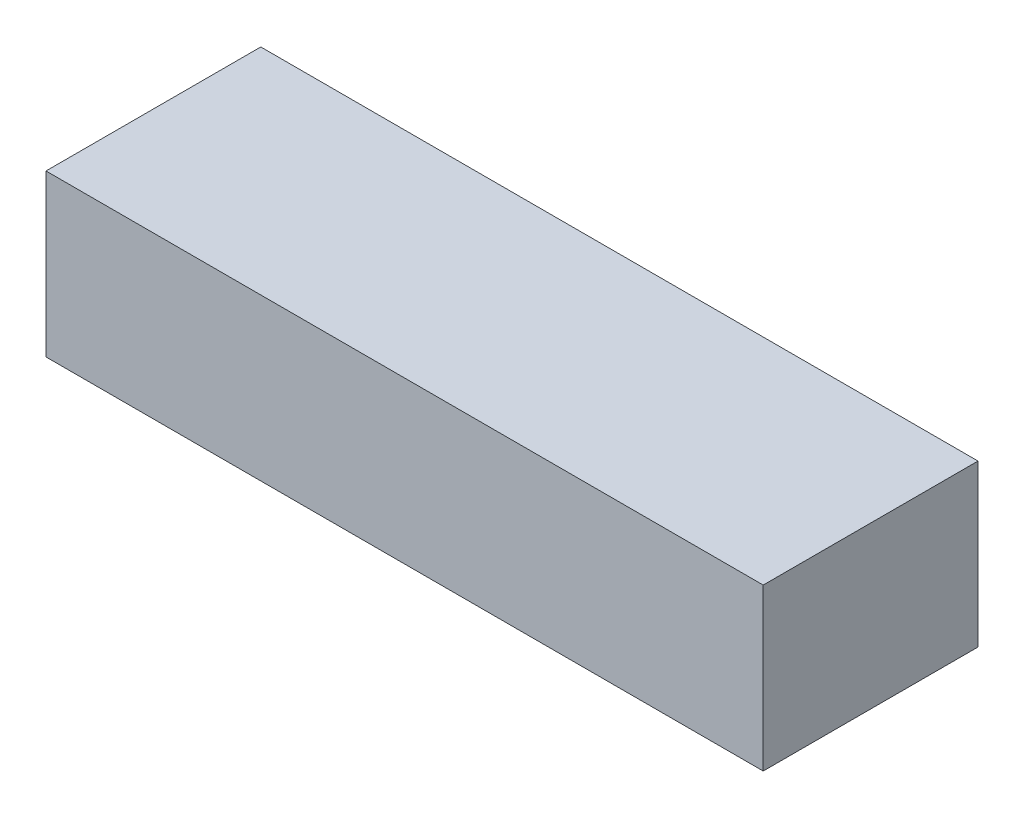
ISO-10303-21;
HEADER;
FILE_DESCRIPTION(('STEP AP214'),'2;1');
FILE_NAME('part.step','',(''),(''),'','','');
FILE_SCHEMA(('AUTOMOTIVE_DESIGN { 1 0 10303 214 1 1 1 1 }'));
ENDSEC;
DATA;
#1=APPLICATION_CONTEXT('core data for automotive mechanical design processes');
#2=APPLICATION_PROTOCOL_DEFINITION('international standard','automotive_design',2000,#1);
#3=PRODUCT_CONTEXT('',#1,'mechanical');
#4=PRODUCT('Part','Part','',(#3));
#5=PRODUCT_RELATED_PRODUCT_CATEGORY('part','',(#4));
#6=PRODUCT_DEFINITION_FORMATION('','',#4);
#7=PRODUCT_DEFINITION_CONTEXT('part definition',#1,'design');
#8=PRODUCT_DEFINITION('design','',#6,#7);
#9=PRODUCT_DEFINITION_SHAPE('','',#8);
#10=(LENGTH_UNIT() NAMED_UNIT(*) SI_UNIT(.MILLI.,.METRE.));
#11=(NAMED_UNIT(*) PLANE_ANGLE_UNIT() SI_UNIT($,.RADIAN.));
#12=(NAMED_UNIT(*) SI_UNIT($,.STERADIAN.) SOLID_ANGLE_UNIT());
#13=UNCERTAINTY_MEASURE_WITH_UNIT(LENGTH_MEASURE(1.E-05),#10,'distance_accuracy_value','');
#14=(GEOMETRIC_REPRESENTATION_CONTEXT(3) GLOBAL_UNCERTAINTY_ASSIGNED_CONTEXT((#13)) GLOBAL_UNIT_ASSIGNED_CONTEXT((#10,
#11,#12)) REPRESENTATION_CONTEXT('',''));
#15=CARTESIAN_POINT('',(0.,0.,0.));
#16=DIRECTION('',(0.,0.,1.));
#17=DIRECTION('',(1.,0.,0.));
#18=AXIS2_PLACEMENT_3D('',#15,#16,#17);
#19=CARTESIAN_POINT('',(-467.5,-210.,-280.));
#20=DIRECTION('',(-1.,0.,0.));
#21=DIRECTION('',(0.,0.,1.));
#22=AXIS2_PLACEMENT_3D('',#19,#20,#21);
#23=PLANE('',#22);
#24=DIRECTION('',(0.,0.,1.));
#25=VECTOR('',#24,1.);
#26=CARTESIAN_POINT('',(-467.5,0.,-280.));
#27=LINE('',#26,#25);
#28=CARTESIAN_POINT('',(-467.5,0.,-280.));
#29=VERTEX_POINT('',#28);
#30=CARTESIAN_POINT('',(-467.5,0.,0.));
#31=VERTEX_POINT('',#30);
#32=EDGE_CURVE('E97',#29,#31,#27,.T.);
#33=ORIENTED_EDGE('',*,*,#32,.F.);
#34=DIRECTION('',(0.,1.,0.));
#35=VECTOR('',#34,1.);
#36=CARTESIAN_POINT('',(-467.5,-210.,-280.));
#37=LINE('',#36,#35);
#38=CARTESIAN_POINT('',(-467.5,-210.,-280.));
#39=VERTEX_POINT('',#38);
#40=EDGE_CURVE('E11',#39,#29,#37,.T.);
#41=ORIENTED_EDGE('',*,*,#40,.F.);
#42=DIRECTION('',(0.,0.,1.));
#43=VECTOR('',#42,1.);
#44=CARTESIAN_POINT('',(-467.5,-210.,-280.));
#45=LINE('',#44,#43);
#46=CARTESIAN_POINT('',(-467.5,-210.,0.));
#47=VERTEX_POINT('',#46);
#48=EDGE_CURVE('E91',#39,#47,#45,.T.);
#49=ORIENTED_EDGE('',*,*,#48,.T.);
#50=DIRECTION('',(0.,1.,0.));
#51=VECTOR('',#50,1.);
#52=CARTESIAN_POINT('',(-467.5,-210.,0.));
#53=LINE('',#52,#51);
#54=EDGE_CURVE('E36',#47,#31,#53,.T.);
#55=ORIENTED_EDGE('',*,*,#54,.T.);
#56=EDGE_LOOP('',(#33,#41,#49,#55));
#57=FACE_BOUND('',#56,.T.);
#58=ADVANCED_FACE('F33',(#57),#23,.T.);
#59=CARTESIAN_POINT('',(-467.5,-210.,-280.));
#60=DIRECTION('',(0.,0.,-1.));
#61=DIRECTION('',(-1.,0.,0.));
#62=AXIS2_PLACEMENT_3D('',#59,#60,#61);
#63=PLANE('',#62);
#64=DIRECTION('',(-1.,0.,0.));
#65=VECTOR('',#64,1.);
#66=CARTESIAN_POINT('',(-467.5,0.,-280.));
#67=LINE('',#66,#65);
#68=CARTESIAN_POINT('',(467.5,0.,-280.));
#69=VERTEX_POINT('',#68);
#70=EDGE_CURVE('E93',#69,#29,#67,.T.);
#71=ORIENTED_EDGE('',*,*,#70,.F.);
#72=DIRECTION('',(0.,1.,0.));
#73=VECTOR('',#72,1.);
#74=CARTESIAN_POINT('',(467.5,-210.,-280.));
#75=LINE('',#74,#73);
#76=CARTESIAN_POINT('',(467.5,-210.,-280.));
#77=VERTEX_POINT('',#76);
#78=EDGE_CURVE('E42',#77,#69,#75,.T.);
#79=ORIENTED_EDGE('',*,*,#78,.F.);
#80=DIRECTION('',(-1.,0.,0.));
#81=VECTOR('',#80,1.);
#82=CARTESIAN_POINT('',(-467.5,-210.,-280.));
#83=LINE('',#82,#81);
#84=EDGE_CURVE('E88',#77,#39,#83,.T.);
#85=ORIENTED_EDGE('',*,*,#84,.T.);
#86=ORIENTED_EDGE('',*,*,#40,.T.);
#87=EDGE_LOOP('',(#71,#79,#85,#86));
#88=FACE_BOUND('',#87,.T.);
#89=ADVANCED_FACE('F107',(#88),#63,.T.);
#90=CARTESIAN_POINT('',(467.5,-210.,-280.));
#91=DIRECTION('',(1.,0.,0.));
#92=DIRECTION('',(0.,0.,-1.));
#93=AXIS2_PLACEMENT_3D('',#90,#91,#92);
#94=PLANE('',#93);
#95=DIRECTION('',(0.,0.,-1.));
#96=VECTOR('',#95,1.);
#97=CARTESIAN_POINT('',(467.5,0.,-280.));
#98=LINE('',#97,#96);
#99=CARTESIAN_POINT('',(467.5,0.,0.));
#100=VERTEX_POINT('',#99);
#101=EDGE_CURVE('E83',#100,#69,#98,.T.);
#102=ORIENTED_EDGE('',*,*,#101,.F.);
#103=DIRECTION('',(0.,1.,0.));
#104=VECTOR('',#103,1.);
#105=CARTESIAN_POINT('',(467.5,-210.,0.));
#106=LINE('',#105,#104);
#107=CARTESIAN_POINT('',(467.5,-210.,0.));
#108=VERTEX_POINT('',#107);
#109=EDGE_CURVE('E78',#108,#100,#106,.T.);
#110=ORIENTED_EDGE('',*,*,#109,.F.);
#111=DIRECTION('',(0.,0.,-1.));
#112=VECTOR('',#111,1.);
#113=CARTESIAN_POINT('',(467.5,-210.,-280.));
#114=LINE('',#113,#112);
#115=EDGE_CURVE('E81',#108,#77,#114,.T.);
#116=ORIENTED_EDGE('',*,*,#115,.T.);
#117=ORIENTED_EDGE('',*,*,#78,.T.);
#118=EDGE_LOOP('',(#102,#110,#116,#117));
#119=FACE_BOUND('',#118,.T.);
#120=ADVANCED_FACE('F80',(#119),#94,.T.);
#121=CARTESIAN_POINT('',(-467.5,-210.,0.));
#122=DIRECTION('',(0.,0.,1.));
#123=DIRECTION('',(1.,0.,0.));
#124=AXIS2_PLACEMENT_3D('',#121,#122,#123);
#125=PLANE('',#124);
#126=DIRECTION('',(1.,0.,0.));
#127=VECTOR('',#126,1.);
#128=CARTESIAN_POINT('',(-467.5,0.,0.));
#129=LINE('',#128,#127);
#130=EDGE_CURVE('E100',#31,#100,#129,.T.);
#131=ORIENTED_EDGE('',*,*,#130,.F.);
#132=ORIENTED_EDGE('',*,*,#54,.F.);
#133=DIRECTION('',(1.,0.,0.));
#134=VECTOR('',#133,1.);
#135=CARTESIAN_POINT('',(-467.5,-210.,0.));
#136=LINE('',#135,#134);
#137=EDGE_CURVE('E87',#47,#108,#136,.T.);
#138=ORIENTED_EDGE('',*,*,#137,.T.);
#139=ORIENTED_EDGE('',*,*,#109,.T.);
#140=EDGE_LOOP('',(#131,#132,#138,#139));
#141=FACE_BOUND('',#140,.T.);
#142=ADVANCED_FACE('F90',(#141),#125,.T.);
#143=CARTESIAN_POINT('',(0.,-210.,0.));
#144=DIRECTION('',(0.,1.,0.));
#145=DIRECTION('',(0.,0.,1.));
#146=AXIS2_PLACEMENT_3D('',#143,#144,#145);
#147=PLANE('',#146);
#148=ORIENTED_EDGE('',*,*,#48,.F.);
#149=ORIENTED_EDGE('',*,*,#84,.F.);
#150=ORIENTED_EDGE('',*,*,#115,.F.);
#151=ORIENTED_EDGE('',*,*,#137,.F.);
#152=EDGE_LOOP('',(#148,#149,#150,#151));
#153=FACE_BOUND('',#152,.T.);
#154=ADVANCED_FACE('F86',(#153),#147,.F.);
#155=CARTESIAN_POINT('',(0.,0.,0.));
#156=DIRECTION('',(0.,1.,0.));
#157=DIRECTION('',(0.,0.,1.));
#158=AXIS2_PLACEMENT_3D('',#155,#156,#157);
#159=PLANE('',#158);
#160=ORIENTED_EDGE('',*,*,#32,.T.);
#161=ORIENTED_EDGE('',*,*,#130,.T.);
#162=ORIENTED_EDGE('',*,*,#101,.T.);
#163=ORIENTED_EDGE('',*,*,#70,.T.);
#164=EDGE_LOOP('',(#160,#161,#162,#163));
#165=FACE_BOUND('',#164,.T.);
#166=ADVANCED_FACE('F106',(#165),#159,.T.);
#167=CLOSED_SHELL('',(#58,#89,#120,#142,#154,#166));
#168=MANIFOLD_SOLID_BREP('B2',#167);
#169=ADVANCED_BREP_SHAPE_REPRESENTATION('',(#18,#168),#14);
#170=SHAPE_DEFINITION_REPRESENTATION(#9,#169);
ENDSEC;
END-ISO-10303-21;
